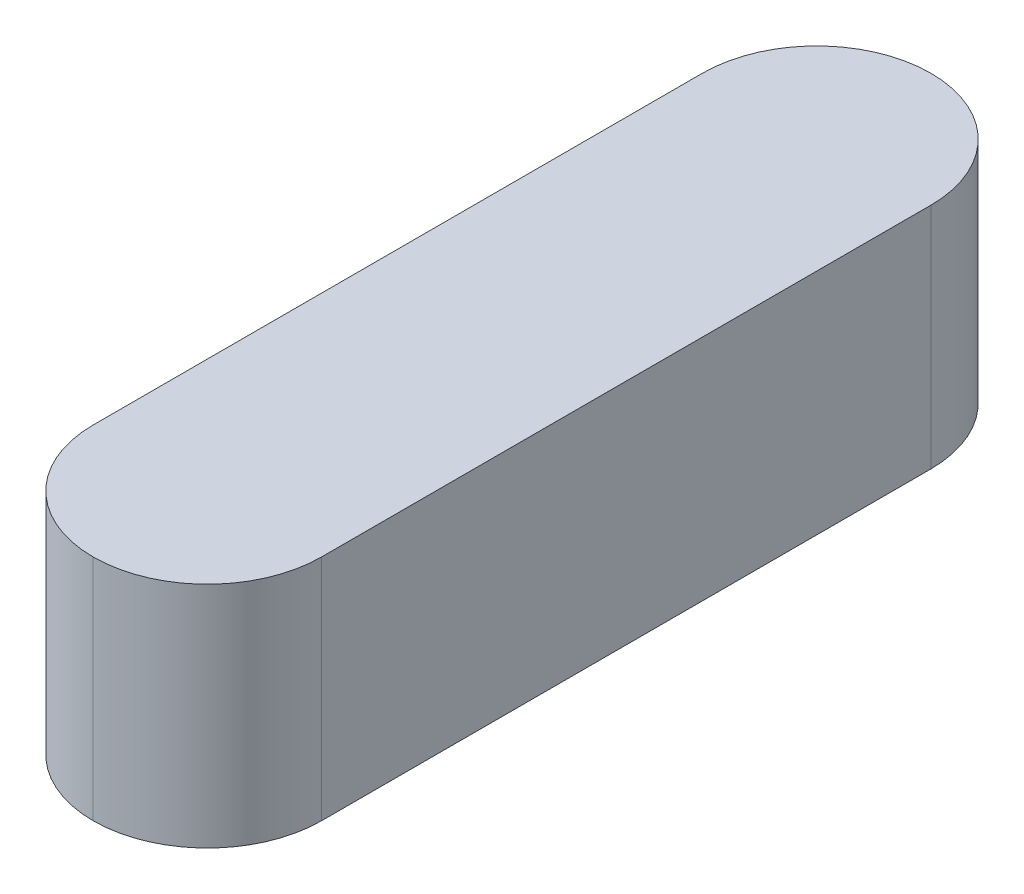
ISO-10303-21;
HEADER;
FILE_DESCRIPTION(('STEP AP214'),'2;1');
FILE_NAME('part.step','',(''),(''),'','','');
FILE_SCHEMA(('AUTOMOTIVE_DESIGN { 1 0 10303 214 1 1 1 1 }'));
ENDSEC;
DATA;
#1=APPLICATION_CONTEXT('core data for automotive mechanical design processes');
#2=APPLICATION_PROTOCOL_DEFINITION('international standard','automotive_design',2000,#1);
#3=PRODUCT_CONTEXT('',#1,'mechanical');
#4=PRODUCT('Part','Part','',(#3));
#5=PRODUCT_RELATED_PRODUCT_CATEGORY('part','',(#4));
#6=PRODUCT_DEFINITION_FORMATION('','',#4);
#7=PRODUCT_DEFINITION_CONTEXT('part definition',#1,'design');
#8=PRODUCT_DEFINITION('design','',#6,#7);
#9=PRODUCT_DEFINITION_SHAPE('','',#8);
#10=(LENGTH_UNIT() NAMED_UNIT(*) SI_UNIT(.MILLI.,.METRE.));
#11=(NAMED_UNIT(*) PLANE_ANGLE_UNIT() SI_UNIT($,.RADIAN.));
#12=(NAMED_UNIT(*) SI_UNIT($,.STERADIAN.) SOLID_ANGLE_UNIT());
#13=UNCERTAINTY_MEASURE_WITH_UNIT(LENGTH_MEASURE(1.E-05),#10,'distance_accuracy_value','');
#14=(GEOMETRIC_REPRESENTATION_CONTEXT(3) GLOBAL_UNCERTAINTY_ASSIGNED_CONTEXT((#13)) GLOBAL_UNIT_ASSIGNED_CONTEXT((#10,
#11,#12)) REPRESENTATION_CONTEXT('',''));
#15=CARTESIAN_POINT('',(0.,0.,0.));
#16=DIRECTION('',(0.,0.,1.));
#17=DIRECTION('',(1.,0.,0.));
#18=AXIS2_PLACEMENT_3D('',#15,#16,#17);
#19=CARTESIAN_POINT('',(0.,1.99629629629633,22.));
#20=DIRECTION('',(1.,0.,0.));
#21=DIRECTION('',(0.,0.,-1.));
#22=AXIS2_PLACEMENT_3D('',#19,#20,#21);
#23=PLANE('',#22);
#24=DIRECTION('',(0.,0.,-1.));
#25=VECTOR('',#24,1.);
#26=CARTESIAN_POINT('',(0.,1.99629629629633,22.));
#27=LINE('',#26,#25);
#28=CARTESIAN_POINT('',(0.,1.99629629629633,19.));
#29=VERTEX_POINT('',#28);
#30=CARTESIAN_POINT('',(0.,1.99629629629633,3.));
#31=VERTEX_POINT('',#30);
#32=EDGE_CURVE('E103',#29,#31,#27,.T.);
#33=ORIENTED_EDGE('',*,*,#32,.F.);
#34=DIRECTION('',(0.,-1.,0.));
#35=VECTOR('',#34,1.);
#36=CARTESIAN_POINT('',(0.,1.99629629629633,19.));
#37=LINE('',#36,#35);
#38=CARTESIAN_POINT('',(0.,7.99629629629633,19.));
#39=VERTEX_POINT('',#38);
#40=EDGE_CURVE('E11',#29,#39,#37,.F.);
#41=ORIENTED_EDGE('',*,*,#40,.T.);
#42=DIRECTION('',(0.,0.,-1.));
#43=VECTOR('',#42,1.);
#44=CARTESIAN_POINT('',(0.,7.99629629629633,22.));
#45=LINE('',#44,#43);
#46=CARTESIAN_POINT('',(0.,7.99629629629633,3.));
#47=VERTEX_POINT('',#46);
#48=EDGE_CURVE('E127',#39,#47,#45,.T.);
#49=ORIENTED_EDGE('',*,*,#48,.T.);
#50=DIRECTION('',(0.,-1.,0.));
#51=VECTOR('',#50,1.);
#52=CARTESIAN_POINT('',(0.,1.99629629629633,3.));
#53=LINE('',#52,#51);
#54=EDGE_CURVE('E45',#47,#31,#53,.T.);
#55=ORIENTED_EDGE('',*,*,#54,.T.);
#56=EDGE_LOOP('',(#33,#41,#49,#55));
#57=FACE_BOUND('',#56,.T.);
#58=ADVANCED_FACE('F36',(#57),#23,.F.);
#59=CARTESIAN_POINT('',(0.,1.99629629629633,22.));
#60=DIRECTION('',(0.,1.,0.));
#61=DIRECTION('',(0.,0.,1.));
#62=AXIS2_PLACEMENT_3D('',#59,#60,#61);
#63=PLANE('',#62);
#64=DIRECTION('',(0.,0.,-1.));
#65=VECTOR('',#64,1.);
#66=CARTESIAN_POINT('',(5.99999999999998,1.99629629629622,22.));
#67=LINE('',#66,#65);
#68=CARTESIAN_POINT('',(5.99999999999998,1.99629629629622,19.));
#69=VERTEX_POINT('',#68);
#70=CARTESIAN_POINT('',(5.99999999999998,1.99629629629622,3.));
#71=VERTEX_POINT('',#70);
#72=EDGE_CURVE('E133',#69,#71,#67,.T.);
#73=ORIENTED_EDGE('',*,*,#72,.F.);
#74=CARTESIAN_POINT('',(2.99999999999999,1.99629629629627,19.));
#75=DIRECTION('',(0.,1.,0.));
#76=DIRECTION('',(0.,0.,1.));
#77=AXIS2_PLACEMENT_3D('',#74,#75,#76);
#78=CIRCLE('',#77,3.);
#79=CARTESIAN_POINT('',(2.99999999999999,1.99629629629627,22.));
#80=VERTEX_POINT('',#79);
#81=EDGE_CURVE('E124',#69,#80,#78,.F.);
#82=ORIENTED_EDGE('',*,*,#81,.T.);
#83=CARTESIAN_POINT('',(2.99999999999999,1.99629629629627,19.));
#84=DIRECTION('',(0.,1.,0.));
#85=DIRECTION('',(0.,0.,1.));
#86=AXIS2_PLACEMENT_3D('',#83,#84,#85);
#87=CIRCLE('',#86,3.);
#88=EDGE_CURVE('E61',#80,#29,#87,.F.);
#89=ORIENTED_EDGE('',*,*,#88,.T.);
#90=ORIENTED_EDGE('',*,*,#32,.T.);
#91=CARTESIAN_POINT('',(2.99999999999999,1.99629629629627,3.));
#92=DIRECTION('',(0.,1.,0.));
#93=DIRECTION('',(0.,0.,1.));
#94=AXIS2_PLACEMENT_3D('',#91,#92,#93);
#95=CIRCLE('',#94,3.);
#96=CARTESIAN_POINT('',(2.99999999999999,1.99629629629627,0.));
#97=VERTEX_POINT('',#96);
#98=EDGE_CURVE('E53',#31,#97,#95,.F.);
#99=ORIENTED_EDGE('',*,*,#98,.T.);
#100=CARTESIAN_POINT('',(2.99999999999999,1.99629629629627,3.));
#101=DIRECTION('',(0.,1.,0.));
#102=DIRECTION('',(0.,0.,1.));
#103=AXIS2_PLACEMENT_3D('',#100,#101,#102);
#104=CIRCLE('',#103,3.);
#105=EDGE_CURVE('E106',#97,#71,#104,.F.);
#106=ORIENTED_EDGE('',*,*,#105,.T.);
#107=EDGE_LOOP('',(#73,#82,#89,#90,#99,#106));
#108=FACE_BOUND('',#107,.T.);
#109=ADVANCED_FACE('F138',(#108),#63,.F.);
#110=CARTESIAN_POINT('',(5.99999999999998,1.99629629629622,22.));
#111=DIRECTION('',(-1.,0.,0.));
#112=DIRECTION('',(0.,0.,1.));
#113=AXIS2_PLACEMENT_3D('',#110,#111,#112);
#114=PLANE('',#113);
#115=DIRECTION('',(0.,0.,-1.));
#116=VECTOR('',#115,1.);
#117=CARTESIAN_POINT('',(5.99999999999994,7.99629629629628,22.));
#118=LINE('',#117,#116);
#119=CARTESIAN_POINT('',(5.99999999999994,7.99629629629628,19.));
#120=VERTEX_POINT('',#119);
#121=CARTESIAN_POINT('',(5.99999999999994,7.99629629629628,3.));
#122=VERTEX_POINT('',#121);
#123=EDGE_CURVE('E100',#120,#122,#118,.T.);
#124=ORIENTED_EDGE('',*,*,#123,.F.);
#125=DIRECTION('',(0.,1.,0.));
#126=VECTOR('',#125,1.);
#127=CARTESIAN_POINT('',(5.99999999999998,1.99629629629622,19.));
#128=LINE('',#127,#126);
#129=EDGE_CURVE('E118',#120,#69,#128,.F.);
#130=ORIENTED_EDGE('',*,*,#129,.T.);
#131=ORIENTED_EDGE('',*,*,#72,.T.);
#132=DIRECTION('',(0.,1.,0.));
#133=VECTOR('',#132,1.);
#134=CARTESIAN_POINT('',(5.99999999999994,7.99629629629628,3.));
#135=LINE('',#134,#133);
#136=EDGE_CURVE('E116',#71,#122,#135,.T.);
#137=ORIENTED_EDGE('',*,*,#136,.T.);
#138=EDGE_LOOP('',(#124,#130,#131,#137));
#139=FACE_BOUND('',#138,.T.);
#140=ADVANCED_FACE('F145',(#139),#114,.F.);
#141=CARTESIAN_POINT('',(0.,7.99629629629633,22.));
#142=DIRECTION('',(0.,-1.,0.));
#143=DIRECTION('',(0.,0.,-1.));
#144=AXIS2_PLACEMENT_3D('',#141,#142,#143);
#145=PLANE('',#144);
#146=CARTESIAN_POINT('',(3.00000000000003,7.99629629629633,19.));
#147=DIRECTION('',(0.,-1.,0.));
#148=DIRECTION('',(0.,0.,-1.));
#149=AXIS2_PLACEMENT_3D('',#146,#147,#148);
#150=CIRCLE('',#149,3.);
#151=CARTESIAN_POINT('',(3.00000000000003,7.99629629629633,22.));
#152=VERTEX_POINT('',#151);
#153=EDGE_CURVE('E109',#39,#152,#150,.F.);
#154=ORIENTED_EDGE('',*,*,#153,.T.);
#155=CARTESIAN_POINT('',(3.00000000000003,7.99629629629633,19.));
#156=DIRECTION('',(0.,-1.,0.));
#157=DIRECTION('',(0.,0.,-1.));
#158=AXIS2_PLACEMENT_3D('',#155,#156,#157);
#159=CIRCLE('',#158,3.);
#160=EDGE_CURVE('E111',#152,#120,#159,.F.);
#161=ORIENTED_EDGE('',*,*,#160,.T.);
#162=ORIENTED_EDGE('',*,*,#123,.T.);
#163=CARTESIAN_POINT('',(3.00000000000003,7.99629629629633,3.));
#164=DIRECTION('',(0.,-1.,0.));
#165=DIRECTION('',(0.,0.,-1.));
#166=AXIS2_PLACEMENT_3D('',#163,#164,#165);
#167=CIRCLE('',#166,3.);
#168=CARTESIAN_POINT('',(3.00000000000003,7.99629629629633,0.));
#169=VERTEX_POINT('',#168);
#170=EDGE_CURVE('E92',#122,#169,#167,.F.);
#171=ORIENTED_EDGE('',*,*,#170,.T.);
#172=CARTESIAN_POINT('',(3.00000000000003,7.99629629629633,3.));
#173=DIRECTION('',(0.,-1.,0.));
#174=DIRECTION('',(0.,0.,-1.));
#175=AXIS2_PLACEMENT_3D('',#172,#173,#174);
#176=CIRCLE('',#175,3.);
#177=EDGE_CURVE('E97',#169,#47,#176,.F.);
#178=ORIENTED_EDGE('',*,*,#177,.T.);
#179=ORIENTED_EDGE('',*,*,#48,.F.);
#180=EDGE_LOOP('',(#154,#161,#162,#171,#178,#179));
#181=FACE_BOUND('',#180,.T.);
#182=ADVANCED_FACE('F94',(#181),#145,.F.);
#183=CARTESIAN_POINT('',(3.00000000000003,7.99629629629633,19.));
#184=DIRECTION('',(0.,-1.,0.));
#185=DIRECTION('',(0.,0.,-1.));
#186=AXIS2_PLACEMENT_3D('',#183,#184,#185);
#187=CYLINDRICAL_SURFACE('',#186,3.);
#188=ORIENTED_EDGE('',*,*,#40,.F.);
#189=ORIENTED_EDGE('',*,*,#88,.F.);
#190=DIRECTION('',(0.,-1.,0.));
#191=VECTOR('',#190,1.);
#192=CARTESIAN_POINT('',(3.00000000000003,7.99629629629633,22.));
#193=LINE('',#192,#191);
#194=EDGE_CURVE('E107',#152,#80,#193,.T.);
#195=ORIENTED_EDGE('',*,*,#194,.F.);
#196=ORIENTED_EDGE('',*,*,#153,.F.);
#197=EDGE_LOOP('',(#188,#189,#195,#196));
#198=FACE_BOUND('',#197,.T.);
#199=ADVANCED_FACE('F142',(#198),#187,.T.);
#200=CARTESIAN_POINT('',(3.00000000000003,7.99629629629633,19.));
#201=DIRECTION('',(0.,1.,0.));
#202=DIRECTION('',(0.,0.,1.));
#203=AXIS2_PLACEMENT_3D('',#200,#201,#202);
#204=CYLINDRICAL_SURFACE('',#203,3.);
#205=ORIENTED_EDGE('',*,*,#81,.F.);
#206=ORIENTED_EDGE('',*,*,#129,.F.);
#207=ORIENTED_EDGE('',*,*,#160,.F.);
#208=ORIENTED_EDGE('',*,*,#194,.T.);
#209=EDGE_LOOP('',(#205,#206,#207,#208));
#210=FACE_BOUND('',#209,.T.);
#211=ADVANCED_FACE('F146',(#210),#204,.T.);
#212=CARTESIAN_POINT('',(2.99999999999999,1.99629629629627,3.));
#213=DIRECTION('',(0.,-1.,0.));
#214=DIRECTION('',(0.,0.,-1.));
#215=AXIS2_PLACEMENT_3D('',#212,#213,#214);
#216=CYLINDRICAL_SURFACE('',#215,3.);
#217=DIRECTION('',(0.,1.,0.));
#218=VECTOR('',#217,1.);
#219=CARTESIAN_POINT('',(2.99999999999999,1.99629629629627,0.));
#220=LINE('',#219,#218);
#221=EDGE_CURVE('E40',#169,#97,#220,.F.);
#222=ORIENTED_EDGE('',*,*,#221,.F.);
#223=ORIENTED_EDGE('',*,*,#170,.F.);
#224=ORIENTED_EDGE('',*,*,#136,.F.);
#225=ORIENTED_EDGE('',*,*,#105,.F.);
#226=EDGE_LOOP('',(#222,#223,#224,#225));
#227=FACE_BOUND('',#226,.T.);
#228=ADVANCED_FACE('F38',(#227),#216,.T.);
#229=CARTESIAN_POINT('',(2.99999999999999,1.99629629629627,3.));
#230=DIRECTION('',(0.,1.,0.));
#231=DIRECTION('',(0.,0.,1.));
#232=AXIS2_PLACEMENT_3D('',#229,#230,#231);
#233=CYLINDRICAL_SURFACE('',#232,3.);
#234=ORIENTED_EDGE('',*,*,#177,.F.);
#235=ORIENTED_EDGE('',*,*,#221,.T.);
#236=ORIENTED_EDGE('',*,*,#98,.F.);
#237=ORIENTED_EDGE('',*,*,#54,.F.);
#238=EDGE_LOOP('',(#234,#235,#236,#237));
#239=FACE_BOUND('',#238,.T.);
#240=ADVANCED_FACE('F108',(#239),#233,.T.);
#241=CLOSED_SHELL('',(#58,#109,#140,#182,#199,#211,#228,#240));
#242=MANIFOLD_SOLID_BREP('B2',#241);
#243=ADVANCED_BREP_SHAPE_REPRESENTATION('',(#18,#242),#14);
#244=SHAPE_DEFINITION_REPRESENTATION(#9,#243);
ENDSEC;
END-ISO-10303-21;
